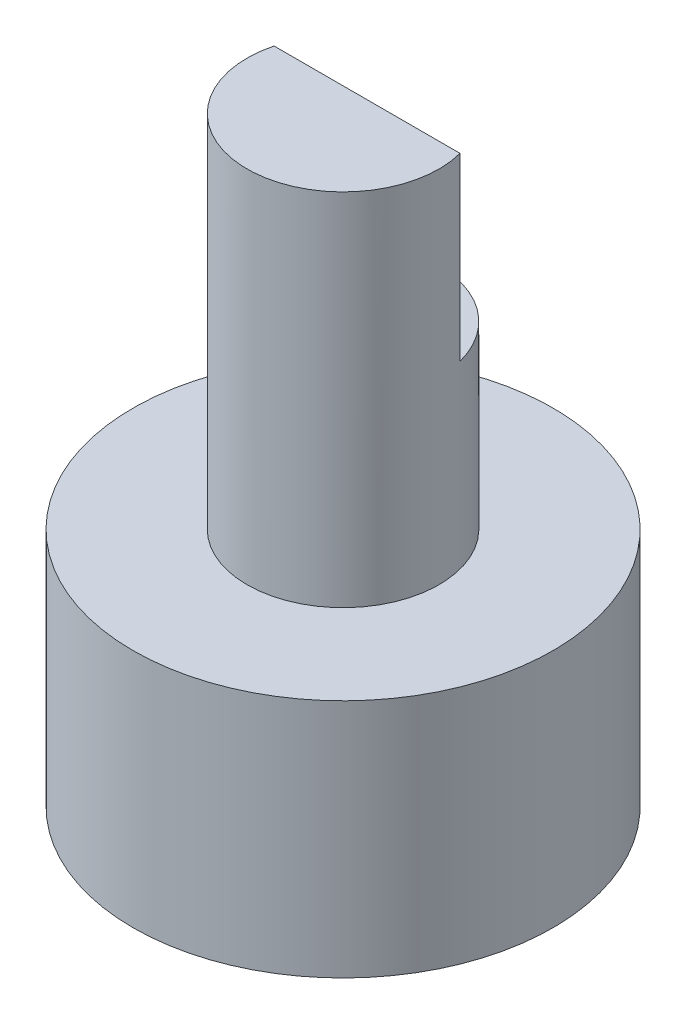
ISO-10303-21;
HEADER;
FILE_DESCRIPTION(('STEP AP214'),'2;1');
FILE_NAME('part.step','',(''),(''),'','','');
FILE_SCHEMA(('AUTOMOTIVE_DESIGN { 1 0 10303 214 1 1 1 1 }'));
ENDSEC;
DATA;
#1=APPLICATION_CONTEXT('core data for automotive mechanical design processes');
#2=APPLICATION_PROTOCOL_DEFINITION('international standard','automotive_design',2000,#1);
#3=PRODUCT_CONTEXT('',#1,'mechanical');
#4=PRODUCT('Part','Part','',(#3));
#5=PRODUCT_RELATED_PRODUCT_CATEGORY('part','',(#4));
#6=PRODUCT_DEFINITION_FORMATION('','',#4);
#7=PRODUCT_DEFINITION_CONTEXT('part definition',#1,'design');
#8=PRODUCT_DEFINITION('design','',#6,#7);
#9=PRODUCT_DEFINITION_SHAPE('','',#8);
#10=(LENGTH_UNIT() NAMED_UNIT(*) SI_UNIT(.MILLI.,.METRE.));
#11=(NAMED_UNIT(*) PLANE_ANGLE_UNIT() SI_UNIT($,.RADIAN.));
#12=(NAMED_UNIT(*) SI_UNIT($,.STERADIAN.) SOLID_ANGLE_UNIT());
#13=UNCERTAINTY_MEASURE_WITH_UNIT(LENGTH_MEASURE(1.E-05),#10,'distance_accuracy_value','');
#14=(GEOMETRIC_REPRESENTATION_CONTEXT(3) GLOBAL_UNCERTAINTY_ASSIGNED_CONTEXT((#13)) GLOBAL_UNIT_ASSIGNED_CONTEXT((#10,
#11,#12)) REPRESENTATION_CONTEXT('',''));
#15=CARTESIAN_POINT('',(0.,0.,0.));
#16=DIRECTION('',(0.,0.,1.));
#17=DIRECTION('',(1.,0.,0.));
#18=AXIS2_PLACEMENT_3D('',#15,#16,#17);
#19=CARTESIAN_POINT('',(0.,8.,0.));
#20=DIRECTION('',(0.,-1.,0.));
#21=DIRECTION('',(0.,0.,-1.));
#22=AXIS2_PLACEMENT_3D('',#19,#20,#21);
#23=CYLINDRICAL_SURFACE('',#22,7.);
#24=CARTESIAN_POINT('',(0.,8.,0.));
#25=DIRECTION('',(0.,1.,0.));
#26=DIRECTION('',(0.,0.,1.));
#27=AXIS2_PLACEMENT_3D('',#24,#25,#26);
#28=CIRCLE('',#27,7.);
#29=CARTESIAN_POINT('',(0.,8.,7.));
#30=VERTEX_POINT('',#29);
#31=EDGE_CURVE('E76',#30,#30,#28,.T.);
#32=ORIENTED_EDGE('',*,*,#31,.F.);
#33=EDGE_LOOP('',(#32));
#34=FACE_BOUND('',#33,.T.);
#35=CARTESIAN_POINT('',(0.,0.,0.));
#36=DIRECTION('',(0.,1.,0.));
#37=DIRECTION('',(0.,0.,1.));
#38=AXIS2_PLACEMENT_3D('',#35,#36,#37);
#39=CIRCLE('',#38,7.);
#40=CARTESIAN_POINT('',(0.,0.,7.));
#41=VERTEX_POINT('',#40);
#42=EDGE_CURVE('E73',#41,#41,#39,.T.);
#43=ORIENTED_EDGE('',*,*,#42,.T.);
#44=EDGE_LOOP('',(#43));
#45=FACE_BOUND('',#44,.T.);
#46=ADVANCED_FACE('F34',(#34,#45),#23,.T.);
#47=CARTESIAN_POINT('',(0.,8.,0.));
#48=DIRECTION('',(0.,1.,0.));
#49=DIRECTION('',(0.,0.,1.));
#50=AXIS2_PLACEMENT_3D('',#47,#48,#49);
#51=PLANE('',#50);
#52=CARTESIAN_POINT('',(0.,8.,0.));
#53=DIRECTION('',(0.,1.,0.));
#54=DIRECTION('',(0.,0.,1.));
#55=AXIS2_PLACEMENT_3D('',#52,#53,#54);
#56=CIRCLE('',#55,3.2);
#57=CARTESIAN_POINT('',(0.,8.,3.2));
#58=VERTEX_POINT('',#57);
#59=EDGE_CURVE('E41',#58,#58,#56,.T.);
#60=ORIENTED_EDGE('',*,*,#59,.F.);
#61=EDGE_LOOP('',(#60));
#62=FACE_BOUND('',#61,.T.);
#63=ORIENTED_EDGE('',*,*,#31,.T.);
#64=EDGE_LOOP('',(#63));
#65=FACE_BOUND('',#64,.T.);
#66=ADVANCED_FACE('F84',(#62,#65),#51,.T.);
#67=CARTESIAN_POINT('',(0.,0.,0.));
#68=DIRECTION('',(0.,1.,0.));
#69=DIRECTION('',(0.,0.,1.));
#70=AXIS2_PLACEMENT_3D('',#67,#68,#69);
#71=PLANE('',#70);
#72=CARTESIAN_POINT('',(0.,0.,0.));
#73=DIRECTION('',(0.,-1.,0.));
#74=DIRECTION('',(0.,0.,-1.));
#75=AXIS2_PLACEMENT_3D('',#72,#73,#74);
#76=CIRCLE('',#75,1.25);
#77=CARTESIAN_POINT('',(0.,0.,-1.25));
#78=VERTEX_POINT('',#77);
#79=EDGE_CURVE('E121',#78,#78,#76,.T.);
#80=ORIENTED_EDGE('',*,*,#79,.F.);
#81=EDGE_LOOP('',(#80));
#82=FACE_BOUND('',#81,.T.);
#83=ORIENTED_EDGE('',*,*,#42,.F.);
#84=EDGE_LOOP('',(#83));
#85=FACE_BOUND('',#84,.T.);
#86=ADVANCED_FACE('F90',(#82,#85),#71,.F.);
#87=CARTESIAN_POINT('',(0.,20.,0.));
#88=DIRECTION('',(0.,-1.,0.));
#89=DIRECTION('',(0.,0.,-1.));
#90=AXIS2_PLACEMENT_3D('',#87,#88,#89);
#91=CYLINDRICAL_SURFACE('',#90,3.2);
#92=CARTESIAN_POINT('',(0.,20.,0.));
#93=DIRECTION('',(0.,1.,0.));
#94=DIRECTION('',(0.,0.,1.));
#95=AXIS2_PLACEMENT_3D('',#92,#93,#94);
#96=CIRCLE('',#95,3.2);
#97=CARTESIAN_POINT('',(-3.09838667696593,20.,-0.8));
#98=VERTEX_POINT('',#97);
#99=CARTESIAN_POINT('',(3.09838667696593,20.,-0.8));
#100=VERTEX_POINT('',#99);
#101=EDGE_CURVE('E70',#98,#100,#96,.T.);
#102=ORIENTED_EDGE('',*,*,#101,.F.);
#103=DIRECTION('',(0.,1.,0.));
#104=VECTOR('',#103,1.);
#105=CARTESIAN_POINT('',(-3.09838667696593,14.,-0.8));
#106=LINE('',#105,#104);
#107=CARTESIAN_POINT('',(-3.09838667696593,14.,-0.8));
#108=VERTEX_POINT('',#107);
#109=EDGE_CURVE('E48',#108,#98,#106,.T.);
#110=ORIENTED_EDGE('',*,*,#109,.F.);
#111=CARTESIAN_POINT('',(0.,14.,0.));
#112=DIRECTION('',(0.,-1.,0.));
#113=DIRECTION('',(0.,0.,-1.));
#114=AXIS2_PLACEMENT_3D('',#111,#112,#113);
#115=CIRCLE('',#114,3.2);
#116=CARTESIAN_POINT('',(3.09838667696593,14.,-0.8));
#117=VERTEX_POINT('',#116);
#118=EDGE_CURVE('E11',#108,#117,#115,.T.);
#119=ORIENTED_EDGE('',*,*,#118,.T.);
#120=DIRECTION('',(0.,1.,0.));
#121=VECTOR('',#120,1.);
#122=CARTESIAN_POINT('',(3.09838667696593,14.,-0.8));
#123=LINE('',#122,#121);
#124=EDGE_CURVE('E54',#117,#100,#123,.T.);
#125=ORIENTED_EDGE('',*,*,#124,.T.);
#126=EDGE_LOOP('',(#102,#110,#119,#125));
#127=FACE_BOUND('',#126,.T.);
#128=ORIENTED_EDGE('',*,*,#59,.T.);
#129=EDGE_LOOP('',(#128));
#130=FACE_BOUND('',#129,.T.);
#131=ADVANCED_FACE('F68',(#127,#130),#91,.T.);
#132=CARTESIAN_POINT('',(0.,20.,0.));
#133=DIRECTION('',(0.,1.,0.));
#134=DIRECTION('',(0.,0.,1.));
#135=AXIS2_PLACEMENT_3D('',#132,#133,#134);
#136=PLANE('',#135);
#137=DIRECTION('',(1.,0.,0.));
#138=VECTOR('',#137,1.);
#139=CARTESIAN_POINT('',(-3.09838667696593,20.,-0.8));
#140=LINE('',#139,#138);
#141=EDGE_CURVE('E59',#98,#100,#140,.T.);
#142=ORIENTED_EDGE('',*,*,#141,.F.);
#143=ORIENTED_EDGE('',*,*,#101,.T.);
#144=EDGE_LOOP('',(#142,#143));
#145=FACE_BOUND('',#144,.T.);
#146=ADVANCED_FACE('F72',(#145),#136,.T.);
#147=CARTESIAN_POINT('',(0.,14.,0.));
#148=DIRECTION('',(0.,-1.,0.));
#149=DIRECTION('',(0.,0.,-1.));
#150=AXIS2_PLACEMENT_3D('',#147,#148,#149);
#151=PLANE('',#150);
#152=DIRECTION('',(1.,0.,0.));
#153=VECTOR('',#152,1.);
#154=CARTESIAN_POINT('',(-3.09838667696593,14.,-0.8));
#155=LINE('',#154,#153);
#156=EDGE_CURVE('E64',#108,#117,#155,.T.);
#157=ORIENTED_EDGE('',*,*,#156,.T.);
#158=ORIENTED_EDGE('',*,*,#118,.F.);
#159=EDGE_LOOP('',(#157,#158));
#160=FACE_BOUND('',#159,.T.);
#161=ADVANCED_FACE('F104',(#160),#151,.F.);
#162=CARTESIAN_POINT('',(-3.09838667696593,14.,-0.8));
#163=DIRECTION('',(0.,0.,1.));
#164=DIRECTION('',(1.,0.,0.));
#165=AXIS2_PLACEMENT_3D('',#162,#163,#164);
#166=PLANE('',#165);
#167=ORIENTED_EDGE('',*,*,#141,.T.);
#168=ORIENTED_EDGE('',*,*,#124,.F.);
#169=ORIENTED_EDGE('',*,*,#156,.F.);
#170=ORIENTED_EDGE('',*,*,#109,.T.);
#171=EDGE_LOOP('',(#167,#168,#169,#170));
#172=FACE_BOUND('',#171,.T.);
#173=ADVANCED_FACE('F60',(#172),#166,.F.);
#174=CARTESIAN_POINT('',(0.,10.,0.));
#175=DIRECTION('',(0.,-1.,0.));
#176=DIRECTION('',(0.,0.,-1.));
#177=AXIS2_PLACEMENT_3D('',#174,#175,#176);
#178=CYLINDRICAL_SURFACE('',#177,1.25);
#179=CARTESIAN_POINT('',(0.,10.,0.));
#180=DIRECTION('',(0.,-1.,0.));
#181=DIRECTION('',(0.,0.,-1.));
#182=AXIS2_PLACEMENT_3D('',#179,#180,#181);
#183=CIRCLE('',#182,1.25);
#184=CARTESIAN_POINT('',(0.,10.,-1.25));
#185=VERTEX_POINT('',#184);
#186=EDGE_CURVE('E65',#185,#185,#183,.T.);
#187=ORIENTED_EDGE('',*,*,#186,.F.);
#188=EDGE_LOOP('',(#187));
#189=FACE_BOUND('',#188,.T.);
#190=ORIENTED_EDGE('',*,*,#79,.T.);
#191=EDGE_LOOP('',(#190));
#192=FACE_BOUND('',#191,.T.);
#193=ADVANCED_FACE('F107',(#189,#192),#178,.F.);
#194=CARTESIAN_POINT('',(0.,10.,0.));
#195=DIRECTION('',(0.,-1.,0.));
#196=DIRECTION('',(0.,0.,-1.));
#197=AXIS2_PLACEMENT_3D('',#194,#195,#196);
#198=PLANE('',#197);
#199=ORIENTED_EDGE('',*,*,#186,.T.);
#200=EDGE_LOOP('',(#199));
#201=FACE_BOUND('',#200,.T.);
#202=ADVANCED_FACE('F113',(#201),#198,.T.);
#203=CLOSED_SHELL('',(#46,#66,#86,#131,#146,#161,#173,#193,#202));
#204=MANIFOLD_SOLID_BREP('B2',#203);
#205=ADVANCED_BREP_SHAPE_REPRESENTATION('',(#18,#204),#14);
#206=SHAPE_DEFINITION_REPRESENTATION(#9,#205);
ENDSEC;
END-ISO-10303-21;
